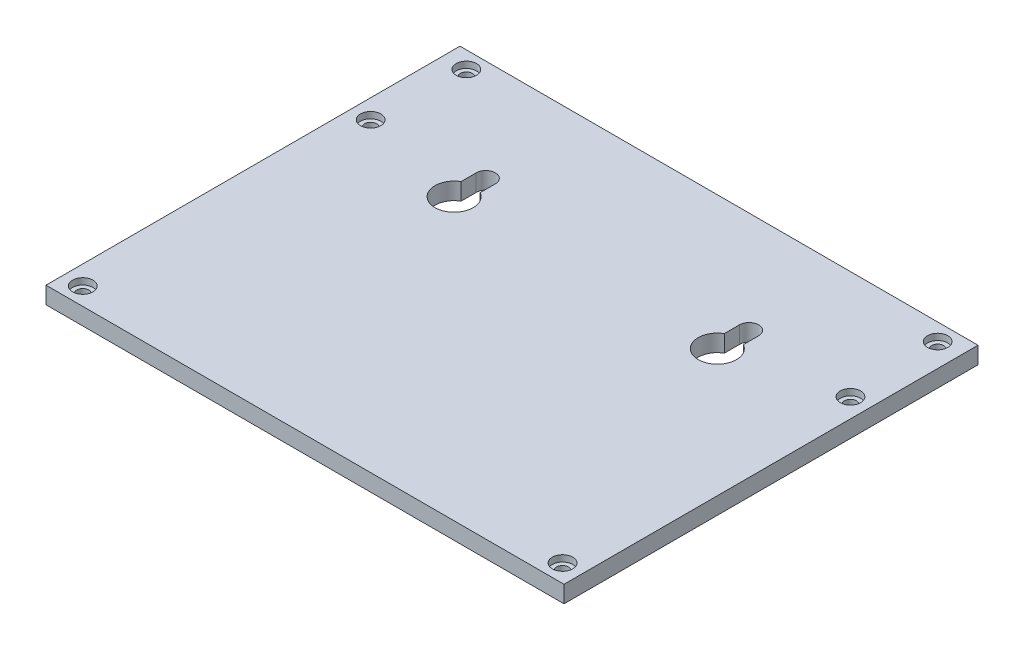
ISO-10303-21;
HEADER;
FILE_DESCRIPTION(('STEP AP214'),'2;1');
FILE_NAME('part.step','',(''),(''),'','','');
FILE_SCHEMA(('AUTOMOTIVE_DESIGN { 1 0 10303 214 1 1 1 1 }'));
ENDSEC;
DATA;
#1=APPLICATION_CONTEXT('core data for automotive mechanical design processes');
#2=APPLICATION_PROTOCOL_DEFINITION('international standard','automotive_design',2000,#1);
#3=PRODUCT_CONTEXT('',#1,'mechanical');
#4=PRODUCT('Part','Part','',(#3));
#5=PRODUCT_RELATED_PRODUCT_CATEGORY('part','',(#4));
#6=PRODUCT_DEFINITION_FORMATION('','',#4);
#7=PRODUCT_DEFINITION_CONTEXT('part definition',#1,'design');
#8=PRODUCT_DEFINITION('design','',#6,#7);
#9=PRODUCT_DEFINITION_SHAPE('','',#8);
#10=(LENGTH_UNIT() NAMED_UNIT(*) SI_UNIT(.MILLI.,.METRE.));
#11=(NAMED_UNIT(*) PLANE_ANGLE_UNIT() SI_UNIT($,.RADIAN.));
#12=(NAMED_UNIT(*) SI_UNIT($,.STERADIAN.) SOLID_ANGLE_UNIT());
#13=UNCERTAINTY_MEASURE_WITH_UNIT(LENGTH_MEASURE(1.E-05),#10,'distance_accuracy_value','');
#14=(GEOMETRIC_REPRESENTATION_CONTEXT(3) GLOBAL_UNCERTAINTY_ASSIGNED_CONTEXT((#13)) GLOBAL_UNIT_ASSIGNED_CONTEXT((#10,
#11,#12)) REPRESENTATION_CONTEXT('',''));
#15=CARTESIAN_POINT('',(0.,0.,0.));
#16=DIRECTION('',(0.,0.,1.));
#17=DIRECTION('',(1.,0.,0.));
#18=AXIS2_PLACEMENT_3D('',#15,#16,#17);
#19=CARTESIAN_POINT('',(-86.90625,0.,53.261875));
#20=DIRECTION('',(0.,1.,0.));
#21=DIRECTION('',(0.,0.,1.));
#22=AXIS2_PLACEMENT_3D('',#19,#20,#21);
#23=CYLINDRICAL_SURFACE('',#22,1.4);
#24=CARTESIAN_POINT('',(-86.90625,0.,53.261875));
#25=DIRECTION('',(0.,1.,0.));
#26=DIRECTION('',(0.,0.,1.));
#27=AXIS2_PLACEMENT_3D('',#24,#25,#26);
#28=CIRCLE('',#27,1.4);
#29=CARTESIAN_POINT('',(-86.90625,0.,54.661875));
#30=VERTEX_POINT('',#29);
#31=EDGE_CURVE('E245',#30,#30,#28,.T.);
#32=ORIENTED_EDGE('',*,*,#31,.F.);
#33=EDGE_LOOP('',(#32));
#34=FACE_BOUND('',#33,.T.);
#35=CARTESIAN_POINT('',(-86.90625,2.5,53.261875));
#36=DIRECTION('',(0.,1.,0.));
#37=DIRECTION('',(0.,0.,1.));
#38=AXIS2_PLACEMENT_3D('',#35,#36,#37);
#39=CIRCLE('',#38,1.4);
#40=CARTESIAN_POINT('',(-86.90625,2.5,54.661875));
#41=VERTEX_POINT('',#40);
#42=EDGE_CURVE('E39',#41,#41,#39,.F.);
#43=ORIENTED_EDGE('',*,*,#42,.F.);
#44=EDGE_LOOP('',(#43));
#45=FACE_BOUND('',#44,.T.);
#46=ADVANCED_FACE('F35',(#34,#45),#23,.F.);
#47=CARTESIAN_POINT('',(25.09375,0.,-36.078125));
#48=DIRECTION('',(0.,1.,0.));
#49=DIRECTION('',(0.,0.,1.));
#50=AXIS2_PLACEMENT_3D('',#47,#48,#49);
#51=CYLINDRICAL_SURFACE('',#50,1.4);
#52=CARTESIAN_POINT('',(25.09375,0.,-36.078125));
#53=DIRECTION('',(0.,1.,0.));
#54=DIRECTION('',(0.,0.,1.));
#55=AXIS2_PLACEMENT_3D('',#52,#53,#54);
#56=CIRCLE('',#55,1.4);
#57=CARTESIAN_POINT('',(25.09375,0.,-34.678125));
#58=VERTEX_POINT('',#57);
#59=EDGE_CURVE('E232',#58,#58,#56,.T.);
#60=ORIENTED_EDGE('',*,*,#59,.F.);
#61=EDGE_LOOP('',(#60));
#62=FACE_BOUND('',#61,.T.);
#63=CARTESIAN_POINT('',(25.09375,2.5,-36.078125));
#64=DIRECTION('',(0.,1.,0.));
#65=DIRECTION('',(0.,0.,1.));
#66=AXIS2_PLACEMENT_3D('',#63,#64,#65);
#67=CIRCLE('',#66,1.4);
#68=CARTESIAN_POINT('',(25.09375,2.5,-34.678125));
#69=VERTEX_POINT('',#68);
#70=EDGE_CURVE('E286',#69,#69,#67,.F.);
#71=ORIENTED_EDGE('',*,*,#70,.F.);
#72=EDGE_LOOP('',(#71));
#73=FACE_BOUND('',#72,.T.);
#74=ADVANCED_FACE('F296',(#62,#73),#51,.F.);
#75=CARTESIAN_POINT('',(-86.90625,0.,-14.538125));
#76=DIRECTION('',(0.,1.,0.));
#77=DIRECTION('',(0.,0.,1.));
#78=AXIS2_PLACEMENT_3D('',#75,#76,#77);
#79=CYLINDRICAL_SURFACE('',#78,1.4);
#80=CARTESIAN_POINT('',(-86.90625,0.,-14.538125));
#81=DIRECTION('',(0.,1.,0.));
#82=DIRECTION('',(0.,0.,1.));
#83=AXIS2_PLACEMENT_3D('',#80,#81,#82);
#84=CIRCLE('',#83,1.4);
#85=CARTESIAN_POINT('',(-86.90625,0.,-13.138125));
#86=VERTEX_POINT('',#85);
#87=EDGE_CURVE('E242',#86,#86,#84,.T.);
#88=ORIENTED_EDGE('',*,*,#87,.F.);
#89=EDGE_LOOP('',(#88));
#90=FACE_BOUND('',#89,.T.);
#91=CARTESIAN_POINT('',(-86.90625,2.5,-14.538125));
#92=DIRECTION('',(0.,1.,0.));
#93=DIRECTION('',(0.,0.,1.));
#94=AXIS2_PLACEMENT_3D('',#91,#92,#93);
#95=CIRCLE('',#94,1.4);
#96=CARTESIAN_POINT('',(-86.90625,2.5,-13.138125));
#97=VERTEX_POINT('',#96);
#98=EDGE_CURVE('E284',#97,#97,#95,.F.);
#99=ORIENTED_EDGE('',*,*,#98,.F.);
#100=EDGE_LOOP('',(#99));
#101=FACE_BOUND('',#100,.T.);
#102=ADVANCED_FACE('F302',(#90,#101),#79,.F.);
#103=CARTESIAN_POINT('',(26.09375,0.,-14.538125));
#104=DIRECTION('',(0.,1.,0.));
#105=DIRECTION('',(0.,0.,1.));
#106=AXIS2_PLACEMENT_3D('',#103,#104,#105);
#107=CYLINDRICAL_SURFACE('',#106,1.4);
#108=CARTESIAN_POINT('',(26.09375,0.,-14.538125));
#109=DIRECTION('',(0.,1.,0.));
#110=DIRECTION('',(0.,0.,1.));
#111=AXIS2_PLACEMENT_3D('',#108,#109,#110);
#112=CIRCLE('',#111,1.4);
#113=CARTESIAN_POINT('',(26.09375,0.,-13.138125));
#114=VERTEX_POINT('',#113);
#115=EDGE_CURVE('E239',#114,#114,#112,.T.);
#116=ORIENTED_EDGE('',*,*,#115,.F.);
#117=EDGE_LOOP('',(#116));
#118=FACE_BOUND('',#117,.T.);
#119=CARTESIAN_POINT('',(26.09375,2.5,-14.538125));
#120=DIRECTION('',(0.,1.,0.));
#121=DIRECTION('',(0.,0.,1.));
#122=AXIS2_PLACEMENT_3D('',#119,#120,#121);
#123=CIRCLE('',#122,1.4);
#124=CARTESIAN_POINT('',(26.09375,2.5,-13.138125));
#125=VERTEX_POINT('',#124);
#126=EDGE_CURVE('E281',#125,#125,#123,.F.);
#127=ORIENTED_EDGE('',*,*,#126,.F.);
#128=EDGE_LOOP('',(#127));
#129=FACE_BOUND('',#128,.T.);
#130=ADVANCED_FACE('F308',(#118,#129),#107,.F.);
#131=CARTESIAN_POINT('',(26.09375,0.,53.261875));
#132=DIRECTION('',(0.,1.,0.));
#133=DIRECTION('',(0.,0.,1.));
#134=AXIS2_PLACEMENT_3D('',#131,#132,#133);
#135=CYLINDRICAL_SURFACE('',#134,1.4);
#136=CARTESIAN_POINT('',(26.09375,0.,53.261875));
#137=DIRECTION('',(0.,1.,0.));
#138=DIRECTION('',(0.,0.,1.));
#139=AXIS2_PLACEMENT_3D('',#136,#137,#138);
#140=CIRCLE('',#139,1.4);
#141=CARTESIAN_POINT('',(26.09375,0.,54.661875));
#142=VERTEX_POINT('',#141);
#143=EDGE_CURVE('E236',#142,#142,#140,.T.);
#144=ORIENTED_EDGE('',*,*,#143,.F.);
#145=EDGE_LOOP('',(#144));
#146=FACE_BOUND('',#145,.T.);
#147=CARTESIAN_POINT('',(26.09375,2.5,53.261875));
#148=DIRECTION('',(0.,1.,0.));
#149=DIRECTION('',(0.,0.,1.));
#150=AXIS2_PLACEMENT_3D('',#147,#148,#149);
#151=CIRCLE('',#150,1.4);
#152=CARTESIAN_POINT('',(26.09375,2.5,54.661875));
#153=VERTEX_POINT('',#152);
#154=EDGE_CURVE('E278',#153,#153,#151,.F.);
#155=ORIENTED_EDGE('',*,*,#154,.F.);
#156=EDGE_LOOP('',(#155));
#157=FACE_BOUND('',#156,.T.);
#158=ADVANCED_FACE('F347',(#146,#157),#135,.F.);
#159=CARTESIAN_POINT('',(-85.90625,0.,-36.078125));
#160=DIRECTION('',(0.,1.,0.));
#161=DIRECTION('',(0.,0.,1.));
#162=AXIS2_PLACEMENT_3D('',#159,#160,#161);
#163=CYLINDRICAL_SURFACE('',#162,1.4);
#164=CARTESIAN_POINT('',(-85.90625,0.,-36.078125));
#165=DIRECTION('',(0.,1.,0.));
#166=DIRECTION('',(0.,0.,1.));
#167=AXIS2_PLACEMENT_3D('',#164,#165,#166);
#168=CIRCLE('',#167,1.4);
#169=CARTESIAN_POINT('',(-85.90625,0.,-34.678125));
#170=VERTEX_POINT('',#169);
#171=EDGE_CURVE('E235',#170,#170,#168,.T.);
#172=ORIENTED_EDGE('',*,*,#171,.F.);
#173=EDGE_LOOP('',(#172));
#174=FACE_BOUND('',#173,.T.);
#175=CARTESIAN_POINT('',(-85.90625,2.5,-36.078125));
#176=DIRECTION('',(0.,1.,0.));
#177=DIRECTION('',(0.,0.,1.));
#178=AXIS2_PLACEMENT_3D('',#175,#176,#177);
#179=CIRCLE('',#178,1.4);
#180=CARTESIAN_POINT('',(-85.90625,2.5,-34.678125));
#181=VERTEX_POINT('',#180);
#182=EDGE_CURVE('E229',#181,#181,#179,.F.);
#183=ORIENTED_EDGE('',*,*,#182,.F.);
#184=EDGE_LOOP('',(#183));
#185=FACE_BOUND('',#184,.T.);
#186=ADVANCED_FACE('F330',(#174,#185),#163,.F.);
#187=CARTESIAN_POINT('',(-91.40625,4.,-40.078125));
#188=DIRECTION('',(1.,0.,0.));
#189=DIRECTION('',(0.,0.,-1.));
#190=AXIS2_PLACEMENT_3D('',#187,#188,#189);
#191=PLANE('',#190);
#192=DIRECTION('',(0.,0.,1.));
#193=VECTOR('',#192,1.);
#194=CARTESIAN_POINT('',(-91.40625,0.,-40.078125));
#195=LINE('',#194,#193);
#196=CARTESIAN_POINT('',(-91.40625,0.,-40.078125));
#197=VERTEX_POINT('',#196);
#198=CARTESIAN_POINT('',(-91.40625,0.,57.421875));
#199=VERTEX_POINT('',#198);
#200=EDGE_CURVE('E250',#197,#199,#195,.T.);
#201=ORIENTED_EDGE('',*,*,#200,.T.);
#202=DIRECTION('',(0.,-1.,0.));
#203=VECTOR('',#202,1.);
#204=CARTESIAN_POINT('',(-91.40625,4.,57.421875));
#205=LINE('',#204,#203);
#206=CARTESIAN_POINT('',(-91.40625,4.,57.421875));
#207=VERTEX_POINT('',#206);
#208=EDGE_CURVE('E11',#207,#199,#205,.T.);
#209=ORIENTED_EDGE('',*,*,#208,.F.);
#210=DIRECTION('',(0.,0.,1.));
#211=VECTOR('',#210,1.);
#212=CARTESIAN_POINT('',(-91.40625,4.,-40.078125));
#213=LINE('',#212,#211);
#214=CARTESIAN_POINT('',(-91.40625,4.,-40.078125));
#215=VERTEX_POINT('',#214);
#216=EDGE_CURVE('E251',#215,#207,#213,.T.);
#217=ORIENTED_EDGE('',*,*,#216,.F.);
#218=DIRECTION('',(0.,-1.,0.));
#219=VECTOR('',#218,1.);
#220=CARTESIAN_POINT('',(-91.40625,4.,-40.078125));
#221=LINE('',#220,#219);
#222=EDGE_CURVE('E261',#215,#197,#221,.T.);
#223=ORIENTED_EDGE('',*,*,#222,.T.);
#224=EDGE_LOOP('',(#201,#209,#217,#223));
#225=FACE_BOUND('',#224,.T.);
#226=ADVANCED_FACE('F37',(#225),#191,.F.);
#227=CARTESIAN_POINT('',(-91.40625,4.,57.421875));
#228=DIRECTION('',(0.,0.,-1.));
#229=DIRECTION('',(-1.,0.,0.));
#230=AXIS2_PLACEMENT_3D('',#227,#228,#229);
#231=PLANE('',#230);
#232=DIRECTION('',(1.,0.,0.));
#233=VECTOR('',#232,1.);
#234=CARTESIAN_POINT('',(-91.40625,0.,57.421875));
#235=LINE('',#234,#233);
#236=CARTESIAN_POINT('',(30.59375,0.,57.421875));
#237=VERTEX_POINT('',#236);
#238=EDGE_CURVE('E264',#199,#237,#235,.T.);
#239=ORIENTED_EDGE('',*,*,#238,.T.);
#240=DIRECTION('',(0.,-1.,0.));
#241=VECTOR('',#240,1.);
#242=CARTESIAN_POINT('',(30.59375,4.,57.421875));
#243=LINE('',#242,#241);
#244=CARTESIAN_POINT('',(30.59375,4.,57.421875));
#245=VERTEX_POINT('',#244);
#246=EDGE_CURVE('E44',#245,#237,#243,.T.);
#247=ORIENTED_EDGE('',*,*,#246,.F.);
#248=DIRECTION('',(1.,0.,0.));
#249=VECTOR('',#248,1.);
#250=CARTESIAN_POINT('',(-91.40625,4.,57.421875));
#251=LINE('',#250,#249);
#252=EDGE_CURVE('E254',#207,#245,#251,.T.);
#253=ORIENTED_EDGE('',*,*,#252,.F.);
#254=ORIENTED_EDGE('',*,*,#208,.T.);
#255=EDGE_LOOP('',(#239,#247,#253,#254));
#256=FACE_BOUND('',#255,.T.);
#257=ADVANCED_FACE('F323',(#256),#231,.F.);
#258=CARTESIAN_POINT('',(30.59375,4.,-40.078125));
#259=DIRECTION('',(-1.,0.,0.));
#260=DIRECTION('',(0.,0.,1.));
#261=AXIS2_PLACEMENT_3D('',#258,#259,#260);
#262=PLANE('',#261);
#263=DIRECTION('',(0.,0.,-1.));
#264=VECTOR('',#263,1.);
#265=CARTESIAN_POINT('',(30.59375,0.,-40.078125));
#266=LINE('',#265,#264);
#267=CARTESIAN_POINT('',(30.59375,0.,-40.078125));
#268=VERTEX_POINT('',#267);
#269=EDGE_CURVE('E266',#237,#268,#266,.T.);
#270=ORIENTED_EDGE('',*,*,#269,.T.);
#271=DIRECTION('',(0.,-1.,0.));
#272=VECTOR('',#271,1.);
#273=CARTESIAN_POINT('',(30.59375,4.,-40.078125));
#274=LINE('',#273,#272);
#275=CARTESIAN_POINT('',(30.59375,4.,-40.078125));
#276=VERTEX_POINT('',#275);
#277=EDGE_CURVE('E271',#276,#268,#274,.T.);
#278=ORIENTED_EDGE('',*,*,#277,.F.);
#279=DIRECTION('',(0.,0.,-1.));
#280=VECTOR('',#279,1.);
#281=CARTESIAN_POINT('',(30.59375,4.,-40.078125));
#282=LINE('',#281,#280);
#283=EDGE_CURVE('E257',#245,#276,#282,.T.);
#284=ORIENTED_EDGE('',*,*,#283,.F.);
#285=ORIENTED_EDGE('',*,*,#246,.T.);
#286=EDGE_LOOP('',(#270,#278,#284,#285));
#287=FACE_BOUND('',#286,.T.);
#288=ADVANCED_FACE('F320',(#287),#262,.F.);
#289=CARTESIAN_POINT('',(-91.40625,4.,-40.078125));
#290=DIRECTION('',(0.,0.,1.));
#291=DIRECTION('',(1.,0.,0.));
#292=AXIS2_PLACEMENT_3D('',#289,#290,#291);
#293=PLANE('',#292);
#294=DIRECTION('',(-1.,0.,0.));
#295=VECTOR('',#294,1.);
#296=CARTESIAN_POINT('',(-91.40625,0.,-40.078125));
#297=LINE('',#296,#295);
#298=EDGE_CURVE('E255',#268,#197,#297,.T.);
#299=ORIENTED_EDGE('',*,*,#298,.T.);
#300=ORIENTED_EDGE('',*,*,#222,.F.);
#301=DIRECTION('',(-1.,0.,0.));
#302=VECTOR('',#301,1.);
#303=CARTESIAN_POINT('',(-91.40625,4.,-40.078125));
#304=LINE('',#303,#302);
#305=EDGE_CURVE('E259',#276,#215,#304,.T.);
#306=ORIENTED_EDGE('',*,*,#305,.F.);
#307=ORIENTED_EDGE('',*,*,#277,.T.);
#308=EDGE_LOOP('',(#299,#300,#306,#307));
#309=FACE_BOUND('',#308,.T.);
#310=ADVANCED_FACE('F313',(#309),#293,.F.);
#311=CARTESIAN_POINT('',(0.,4.,0.));
#312=DIRECTION('',(0.,1.,0.));
#313=DIRECTION('',(0.,0.,1.));
#314=AXIS2_PLACEMENT_3D('',#311,#312,#313);
#315=PLANE('',#314);
#316=CARTESIAN_POINT('',(-61.40625,4.,-16.1573157606777));
#317=DIRECTION('',(0.,1.,0.));
#318=DIRECTION('',(0.,0.,-1.));
#319=AXIS2_PLACEMENT_3D('',#316,#317,#318);
#320=CIRCLE('',#319,2.25);
#321=CARTESIAN_POINT('',(-59.15625,4.,-16.1573157606777));
#322=VERTEX_POINT('',#321);
#323=CARTESIAN_POINT('',(-63.65625,4.,-16.1573157606777));
#324=VERTEX_POINT('',#323);
#325=EDGE_CURVE('E52',#322,#324,#320,.T.);
#326=ORIENTED_EDGE('',*,*,#325,.F.);
#327=DIRECTION('',(0.,0.,-1.));
#328=VECTOR('',#327,1.);
#329=CARTESIAN_POINT('',(-59.15625,4.,-16.1573157606777));
#330=LINE('',#329,#328);
#331=CARTESIAN_POINT('',(-59.15625,4.,-12.5862873828199));
#332=VERTEX_POINT('',#331);
#333=EDGE_CURVE('E147',#332,#322,#330,.T.);
#334=ORIENTED_EDGE('',*,*,#333,.F.);
#335=CARTESIAN_POINT('',(-61.40625,4.,-8.68956692335936));
#336=DIRECTION('',(0.,1.,0.));
#337=DIRECTION('',(0.,0.,-1.));
#338=AXIS2_PLACEMENT_3D('',#335,#336,#337);
#339=CIRCLE('',#338,4.49965891364867);
#340=CARTESIAN_POINT('',(-63.65625,4.,-12.5862873828198));
#341=VERTEX_POINT('',#340);
#342=EDGE_CURVE('E150',#341,#332,#339,.T.);
#343=ORIENTED_EDGE('',*,*,#342,.F.);
#344=DIRECTION('',(0.,0.,1.));
#345=VECTOR('',#344,1.);
#346=CARTESIAN_POINT('',(-63.65625,4.,-16.1573157606777));
#347=LINE('',#346,#345);
#348=EDGE_CURVE('E156',#324,#341,#347,.T.);
#349=ORIENTED_EDGE('',*,*,#348,.F.);
#350=EDGE_LOOP('',(#326,#334,#343,#349));
#351=FACE_BOUND('',#350,.T.);
#352=CARTESIAN_POINT('',(0.593749999999969,4.,-16.1573157606777));
#353=DIRECTION('',(0.,1.,0.));
#354=DIRECTION('',(0.,0.,-1.));
#355=AXIS2_PLACEMENT_3D('',#352,#353,#354);
#356=CIRCLE('',#355,2.25);
#357=CARTESIAN_POINT('',(2.84374999999996,4.,-16.1573157606777));
#358=VERTEX_POINT('',#357);
#359=CARTESIAN_POINT('',(-1.65625000000003,4.,-16.1573157606777));
#360=VERTEX_POINT('',#359);
#361=EDGE_CURVE('E60',#358,#360,#356,.T.);
#362=ORIENTED_EDGE('',*,*,#361,.F.);
#363=DIRECTION('',(0.,0.,-1.));
#364=VECTOR('',#363,1.);
#365=CARTESIAN_POINT('',(2.84374999999996,4.,-16.1573157606777));
#366=LINE('',#365,#364);
#367=CARTESIAN_POINT('',(2.84374999999997,4.,-12.5862873828199));
#368=VERTEX_POINT('',#367);
#369=EDGE_CURVE('E171',#368,#358,#366,.T.);
#370=ORIENTED_EDGE('',*,*,#369,.F.);
#371=CARTESIAN_POINT('',(0.593749999999976,4.,-8.68956692335936));
#372=DIRECTION('',(0.,1.,0.));
#373=DIRECTION('',(0.,0.,-1.));
#374=AXIS2_PLACEMENT_3D('',#371,#372,#373);
#375=CIRCLE('',#374,4.49965891364867);
#376=CARTESIAN_POINT('',(-1.65625000000003,4.,-12.5862873828198));
#377=VERTEX_POINT('',#376);
#378=EDGE_CURVE('E185',#377,#368,#375,.T.);
#379=ORIENTED_EDGE('',*,*,#378,.F.);
#380=DIRECTION('',(0.,0.,1.));
#381=VECTOR('',#380,1.);
#382=CARTESIAN_POINT('',(-1.65625000000003,4.,-16.1573157606777));
#383=LINE('',#382,#381);
#384=EDGE_CURVE('E182',#360,#377,#383,.T.);
#385=ORIENTED_EDGE('',*,*,#384,.F.);
#386=EDGE_LOOP('',(#362,#370,#379,#385));
#387=FACE_BOUND('',#386,.T.);
#388=CARTESIAN_POINT('',(-86.90625,4.,53.261875));
#389=DIRECTION('',(0.,1.,0.));
#390=DIRECTION('',(0.,0.,1.));
#391=AXIS2_PLACEMENT_3D('',#388,#389,#390);
#392=CIRCLE('',#391,2.4);
#393=CARTESIAN_POINT('',(-86.90625,4.,55.661875));
#394=VERTEX_POINT('',#393);
#395=EDGE_CURVE('E206',#394,#394,#392,.T.);
#396=ORIENTED_EDGE('',*,*,#395,.F.);
#397=EDGE_LOOP('',(#396));
#398=FACE_BOUND('',#397,.T.);
#399=CARTESIAN_POINT('',(26.09375,4.,53.261875));
#400=DIRECTION('',(0.,1.,0.));
#401=DIRECTION('',(0.,0.,1.));
#402=AXIS2_PLACEMENT_3D('',#399,#400,#401);
#403=CIRCLE('',#402,2.4);
#404=CARTESIAN_POINT('',(26.09375,4.,55.661875));
#405=VERTEX_POINT('',#404);
#406=EDGE_CURVE('E212',#405,#405,#403,.T.);
#407=ORIENTED_EDGE('',*,*,#406,.F.);
#408=EDGE_LOOP('',(#407));
#409=FACE_BOUND('',#408,.T.);
#410=CARTESIAN_POINT('',(26.09375,4.,-14.538125));
#411=DIRECTION('',(0.,1.,0.));
#412=DIRECTION('',(0.,0.,1.));
#413=AXIS2_PLACEMENT_3D('',#410,#411,#412);
#414=CIRCLE('',#413,2.4);
#415=CARTESIAN_POINT('',(26.09375,4.,-12.138125));
#416=VERTEX_POINT('',#415);
#417=EDGE_CURVE('E218',#416,#416,#414,.T.);
#418=ORIENTED_EDGE('',*,*,#417,.F.);
#419=EDGE_LOOP('',(#418));
#420=FACE_BOUND('',#419,.T.);
#421=CARTESIAN_POINT('',(-85.90625,4.,-36.078125));
#422=DIRECTION('',(0.,1.,0.));
#423=DIRECTION('',(0.,0.,1.));
#424=AXIS2_PLACEMENT_3D('',#421,#422,#423);
#425=CIRCLE('',#424,2.4);
#426=CARTESIAN_POINT('',(-85.90625,4.,-33.678125));
#427=VERTEX_POINT('',#426);
#428=EDGE_CURVE('E199',#427,#427,#425,.T.);
#429=ORIENTED_EDGE('',*,*,#428,.F.);
#430=EDGE_LOOP('',(#429));
#431=FACE_BOUND('',#430,.T.);
#432=CARTESIAN_POINT('',(25.09375,4.,-36.078125));
#433=DIRECTION('',(0.,1.,0.));
#434=DIRECTION('',(0.,0.,1.));
#435=AXIS2_PLACEMENT_3D('',#432,#433,#434);
#436=CIRCLE('',#435,2.4);
#437=CARTESIAN_POINT('',(25.09375,4.,-33.678125));
#438=VERTEX_POINT('',#437);
#439=EDGE_CURVE('E163',#438,#438,#436,.T.);
#440=ORIENTED_EDGE('',*,*,#439,.F.);
#441=EDGE_LOOP('',(#440));
#442=FACE_BOUND('',#441,.T.);
#443=CARTESIAN_POINT('',(-86.90625,4.,-14.538125));
#444=DIRECTION('',(0.,1.,0.));
#445=DIRECTION('',(0.,0.,1.));
#446=AXIS2_PLACEMENT_3D('',#443,#444,#445);
#447=CIRCLE('',#446,2.4);
#448=CARTESIAN_POINT('',(-86.90625,4.,-12.138125));
#449=VERTEX_POINT('',#448);
#450=EDGE_CURVE('E205',#449,#449,#447,.T.);
#451=ORIENTED_EDGE('',*,*,#450,.F.);
#452=EDGE_LOOP('',(#451));
#453=FACE_BOUND('',#452,.T.);
#454=ORIENTED_EDGE('',*,*,#216,.T.);
#455=ORIENTED_EDGE('',*,*,#252,.T.);
#456=ORIENTED_EDGE('',*,*,#283,.T.);
#457=ORIENTED_EDGE('',*,*,#305,.T.);
#458=EDGE_LOOP('',(#454,#455,#456,#457));
#459=FACE_BOUND('',#458,.T.);
#460=ADVANCED_FACE('F310',(#351,#387,#398,#409,#420,#431,#442,#453,#459),#315,.T.);
#461=CARTESIAN_POINT('',(0.,0.,0.));
#462=DIRECTION('',(0.,1.,0.));
#463=DIRECTION('',(0.,0.,1.));
#464=AXIS2_PLACEMENT_3D('',#461,#462,#463);
#465=PLANE('',#464);
#466=DIRECTION('',(0.,0.,-1.));
#467=VECTOR('',#466,1.);
#468=CARTESIAN_POINT('',(-59.15625,0.,-16.1573157606777));
#469=LINE('',#468,#467);
#470=CARTESIAN_POINT('',(-59.15625,0.,-12.5862873828199));
#471=VERTEX_POINT('',#470);
#472=CARTESIAN_POINT('',(-59.15625,0.,-16.1573157606777));
#473=VERTEX_POINT('',#472);
#474=EDGE_CURVE('E134',#471,#473,#469,.T.);
#475=ORIENTED_EDGE('',*,*,#474,.T.);
#476=CARTESIAN_POINT('',(-61.40625,0.,-16.1573157606777));
#477=DIRECTION('',(0.,1.,0.));
#478=DIRECTION('',(0.,0.,-1.));
#479=AXIS2_PLACEMENT_3D('',#476,#477,#478);
#480=CIRCLE('',#479,2.25);
#481=CARTESIAN_POINT('',(-63.65625,0.,-16.1573157606777));
#482=VERTEX_POINT('',#481);
#483=EDGE_CURVE('E128',#473,#482,#480,.T.);
#484=ORIENTED_EDGE('',*,*,#483,.T.);
#485=DIRECTION('',(0.,0.,1.));
#486=VECTOR('',#485,1.);
#487=CARTESIAN_POINT('',(-63.65625,0.,-16.1573157606777));
#488=LINE('',#487,#486);
#489=CARTESIAN_POINT('',(-63.65625,0.,-12.5862873828198));
#490=VERTEX_POINT('',#489);
#491=EDGE_CURVE('E138',#482,#490,#488,.T.);
#492=ORIENTED_EDGE('',*,*,#491,.T.);
#493=CARTESIAN_POINT('',(-61.40625,0.,-8.68956692335936));
#494=DIRECTION('',(0.,1.,0.));
#495=DIRECTION('',(0.,0.,-1.));
#496=AXIS2_PLACEMENT_3D('',#493,#494,#495);
#497=CIRCLE('',#496,4.49965891364867);
#498=EDGE_CURVE('E142',#490,#471,#497,.T.);
#499=ORIENTED_EDGE('',*,*,#498,.T.);
#500=EDGE_LOOP('',(#475,#484,#492,#499));
#501=FACE_BOUND('',#500,.T.);
#502=DIRECTION('',(0.,0.,-1.));
#503=VECTOR('',#502,1.);
#504=CARTESIAN_POINT('',(2.84374999999996,0.,-16.1573157606777));
#505=LINE('',#504,#503);
#506=CARTESIAN_POINT('',(2.84374999999997,0.,-12.5862873828199));
#507=VERTEX_POINT('',#506);
#508=CARTESIAN_POINT('',(2.84374999999996,0.,-16.1573157606777));
#509=VERTEX_POINT('',#508);
#510=EDGE_CURVE('E177',#507,#509,#505,.T.);
#511=ORIENTED_EDGE('',*,*,#510,.T.);
#512=CARTESIAN_POINT('',(0.593749999999969,0.,-16.1573157606777));
#513=DIRECTION('',(0.,1.,0.));
#514=DIRECTION('',(0.,0.,-1.));
#515=AXIS2_PLACEMENT_3D('',#512,#513,#514);
#516=CIRCLE('',#515,2.25);
#517=CARTESIAN_POINT('',(-1.65625000000003,0.,-16.1573157606777));
#518=VERTEX_POINT('',#517);
#519=EDGE_CURVE('E167',#509,#518,#516,.T.);
#520=ORIENTED_EDGE('',*,*,#519,.T.);
#521=DIRECTION('',(0.,0.,1.));
#522=VECTOR('',#521,1.);
#523=CARTESIAN_POINT('',(-1.65625000000003,0.,-16.1573157606777));
#524=LINE('',#523,#522);
#525=CARTESIAN_POINT('',(-1.65625000000003,0.,-12.5862873828198));
#526=VERTEX_POINT('',#525);
#527=EDGE_CURVE('E170',#518,#526,#524,.T.);
#528=ORIENTED_EDGE('',*,*,#527,.T.);
#529=CARTESIAN_POINT('',(0.593749999999976,0.,-8.68956692335936));
#530=DIRECTION('',(0.,1.,0.));
#531=DIRECTION('',(0.,0.,-1.));
#532=AXIS2_PLACEMENT_3D('',#529,#530,#531);
#533=CIRCLE('',#532,4.49965891364867);
#534=EDGE_CURVE('E174',#526,#507,#533,.T.);
#535=ORIENTED_EDGE('',*,*,#534,.T.);
#536=EDGE_LOOP('',(#511,#520,#528,#535));
#537=FACE_BOUND('',#536,.T.);
#538=ORIENTED_EDGE('',*,*,#171,.T.);
#539=EDGE_LOOP('',(#538));
#540=FACE_BOUND('',#539,.T.);
#541=ORIENTED_EDGE('',*,*,#143,.T.);
#542=EDGE_LOOP('',(#541));
#543=FACE_BOUND('',#542,.T.);
#544=ORIENTED_EDGE('',*,*,#115,.T.);
#545=EDGE_LOOP('',(#544));
#546=FACE_BOUND('',#545,.T.);
#547=ORIENTED_EDGE('',*,*,#87,.T.);
#548=EDGE_LOOP('',(#547));
#549=FACE_BOUND('',#548,.T.);
#550=ORIENTED_EDGE('',*,*,#59,.T.);
#551=EDGE_LOOP('',(#550));
#552=FACE_BOUND('',#551,.T.);
#553=ORIENTED_EDGE('',*,*,#31,.T.);
#554=EDGE_LOOP('',(#553));
#555=FACE_BOUND('',#554,.T.);
#556=ORIENTED_EDGE('',*,*,#200,.F.);
#557=ORIENTED_EDGE('',*,*,#298,.F.);
#558=ORIENTED_EDGE('',*,*,#269,.F.);
#559=ORIENTED_EDGE('',*,*,#238,.F.);
#560=EDGE_LOOP('',(#556,#557,#558,#559));
#561=FACE_BOUND('',#560,.T.);
#562=ADVANCED_FACE('F144',(#501,#537,#540,#543,#546,#549,#552,#555,#561),#465,.F.);
#563=CARTESIAN_POINT('',(-85.90625,2.5,-36.078125));
#564=DIRECTION('',(0.,1.,0.));
#565=DIRECTION('',(0.,0.,1.));
#566=AXIS2_PLACEMENT_3D('',#563,#564,#565);
#567=PLANE('',#566);
#568=CARTESIAN_POINT('',(-85.90625,2.5,-36.078125));
#569=DIRECTION('',(0.,1.,0.));
#570=DIRECTION('',(0.,0.,1.));
#571=AXIS2_PLACEMENT_3D('',#568,#569,#570);
#572=CIRCLE('',#571,2.4);
#573=CARTESIAN_POINT('',(-85.90625,2.5,-33.678125));
#574=VERTEX_POINT('',#573);
#575=EDGE_CURVE('E221',#574,#574,#572,.T.);
#576=ORIENTED_EDGE('',*,*,#575,.T.);
#577=EDGE_LOOP('',(#576));
#578=FACE_BOUND('',#577,.T.);
#579=ORIENTED_EDGE('',*,*,#182,.T.);
#580=EDGE_LOOP('',(#579));
#581=FACE_BOUND('',#580,.T.);
#582=ADVANCED_FACE('F317',(#578,#581),#567,.T.);
#583=CARTESIAN_POINT('',(-85.90625,2.5,-36.078125));
#584=DIRECTION('',(0.,1.,0.));
#585=DIRECTION('',(0.,0.,1.));
#586=AXIS2_PLACEMENT_3D('',#583,#584,#585);
#587=CYLINDRICAL_SURFACE('',#586,2.4);
#588=ORIENTED_EDGE('',*,*,#575,.F.);
#589=EDGE_LOOP('',(#588));
#590=FACE_BOUND('',#589,.T.);
#591=ORIENTED_EDGE('',*,*,#428,.T.);
#592=EDGE_LOOP('',(#591));
#593=FACE_BOUND('',#592,.T.);
#594=ADVANCED_FACE('F384',(#590,#593),#587,.F.);
#595=CARTESIAN_POINT('',(26.09375,2.5,53.261875));
#596=DIRECTION('',(0.,1.,0.));
#597=DIRECTION('',(0.,0.,1.));
#598=AXIS2_PLACEMENT_3D('',#595,#596,#597);
#599=PLANE('',#598);
#600=CARTESIAN_POINT('',(26.09375,2.5,53.261875));
#601=DIRECTION('',(0.,1.,0.));
#602=DIRECTION('',(0.,0.,1.));
#603=AXIS2_PLACEMENT_3D('',#600,#601,#602);
#604=CIRCLE('',#603,2.4);
#605=CARTESIAN_POINT('',(26.09375,2.5,55.661875));
#606=VERTEX_POINT('',#605);
#607=EDGE_CURVE('E209',#606,#606,#604,.T.);
#608=ORIENTED_EDGE('',*,*,#607,.T.);
#609=EDGE_LOOP('',(#608));
#610=FACE_BOUND('',#609,.T.);
#611=ORIENTED_EDGE('',*,*,#154,.T.);
#612=EDGE_LOOP('',(#611));
#613=FACE_BOUND('',#612,.T.);
#614=ADVANCED_FACE('F387',(#610,#613),#599,.T.);
#615=CARTESIAN_POINT('',(26.09375,2.5,53.261875));
#616=DIRECTION('',(0.,1.,0.));
#617=DIRECTION('',(0.,0.,1.));
#618=AXIS2_PLACEMENT_3D('',#615,#616,#617);
#619=CYLINDRICAL_SURFACE('',#618,2.4);
#620=ORIENTED_EDGE('',*,*,#607,.F.);
#621=EDGE_LOOP('',(#620));
#622=FACE_BOUND('',#621,.T.);
#623=ORIENTED_EDGE('',*,*,#406,.T.);
#624=EDGE_LOOP('',(#623));
#625=FACE_BOUND('',#624,.T.);
#626=ADVANCED_FACE('F394',(#622,#625),#619,.F.);
#627=CARTESIAN_POINT('',(26.09375,2.5,-14.538125));
#628=DIRECTION('',(0.,1.,0.));
#629=DIRECTION('',(0.,0.,1.));
#630=AXIS2_PLACEMENT_3D('',#627,#628,#629);
#631=PLANE('',#630);
#632=CARTESIAN_POINT('',(26.09375,2.5,-14.538125));
#633=DIRECTION('',(0.,1.,0.));
#634=DIRECTION('',(0.,0.,1.));
#635=AXIS2_PLACEMENT_3D('',#632,#633,#634);
#636=CIRCLE('',#635,2.4);
#637=CARTESIAN_POINT('',(26.09375,2.5,-12.138125));
#638=VERTEX_POINT('',#637);
#639=EDGE_CURVE('E215',#638,#638,#636,.T.);
#640=ORIENTED_EDGE('',*,*,#639,.T.);
#641=EDGE_LOOP('',(#640));
#642=FACE_BOUND('',#641,.T.);
#643=ORIENTED_EDGE('',*,*,#126,.T.);
#644=EDGE_LOOP('',(#643));
#645=FACE_BOUND('',#644,.T.);
#646=ADVANCED_FACE('F380',(#642,#645),#631,.T.);
#647=CARTESIAN_POINT('',(26.09375,2.5,-14.538125));
#648=DIRECTION('',(0.,1.,0.));
#649=DIRECTION('',(0.,0.,1.));
#650=AXIS2_PLACEMENT_3D('',#647,#648,#649);
#651=CYLINDRICAL_SURFACE('',#650,2.4);
#652=ORIENTED_EDGE('',*,*,#639,.F.);
#653=EDGE_LOOP('',(#652));
#654=FACE_BOUND('',#653,.T.);
#655=ORIENTED_EDGE('',*,*,#417,.T.);
#656=EDGE_LOOP('',(#655));
#657=FACE_BOUND('',#656,.T.);
#658=ADVANCED_FACE('F370',(#654,#657),#651,.F.);
#659=CARTESIAN_POINT('',(-86.90625,2.5,-14.538125));
#660=DIRECTION('',(0.,1.,0.));
#661=DIRECTION('',(0.,0.,1.));
#662=AXIS2_PLACEMENT_3D('',#659,#660,#661);
#663=PLANE('',#662);
#664=CARTESIAN_POINT('',(-86.90625,2.5,-14.538125));
#665=DIRECTION('',(0.,1.,0.));
#666=DIRECTION('',(0.,0.,1.));
#667=AXIS2_PLACEMENT_3D('',#664,#665,#666);
#668=CIRCLE('',#667,2.4);
#669=CARTESIAN_POINT('',(-86.90625,2.5,-12.138125));
#670=VERTEX_POINT('',#669);
#671=EDGE_CURVE('E226',#670,#670,#668,.T.);
#672=ORIENTED_EDGE('',*,*,#671,.T.);
#673=EDGE_LOOP('',(#672));
#674=FACE_BOUND('',#673,.T.);
#675=ORIENTED_EDGE('',*,*,#98,.T.);
#676=EDGE_LOOP('',(#675));
#677=FACE_BOUND('',#676,.T.);
#678=ADVANCED_FACE('F367',(#674,#677),#663,.T.);
#679=CARTESIAN_POINT('',(-86.90625,2.5,-14.538125));
#680=DIRECTION('',(0.,1.,0.));
#681=DIRECTION('',(0.,0.,1.));
#682=AXIS2_PLACEMENT_3D('',#679,#680,#681);
#683=CYLINDRICAL_SURFACE('',#682,2.4);
#684=ORIENTED_EDGE('',*,*,#671,.F.);
#685=EDGE_LOOP('',(#684));
#686=FACE_BOUND('',#685,.T.);
#687=ORIENTED_EDGE('',*,*,#450,.T.);
#688=EDGE_LOOP('',(#687));
#689=FACE_BOUND('',#688,.T.);
#690=ADVANCED_FACE('F369',(#686,#689),#683,.F.);
#691=CARTESIAN_POINT('',(25.09375,2.5,-36.078125));
#692=DIRECTION('',(0.,1.,0.));
#693=DIRECTION('',(0.,0.,1.));
#694=AXIS2_PLACEMENT_3D('',#691,#692,#693);
#695=PLANE('',#694);
#696=CARTESIAN_POINT('',(25.09375,2.5,-36.078125));
#697=DIRECTION('',(0.,1.,0.));
#698=DIRECTION('',(0.,0.,1.));
#699=AXIS2_PLACEMENT_3D('',#696,#697,#698);
#700=CIRCLE('',#699,2.4);
#701=CARTESIAN_POINT('',(25.09375,2.5,-33.678125));
#702=VERTEX_POINT('',#701);
#703=EDGE_CURVE('E196',#702,#702,#700,.T.);
#704=ORIENTED_EDGE('',*,*,#703,.T.);
#705=EDGE_LOOP('',(#704));
#706=FACE_BOUND('',#705,.T.);
#707=ORIENTED_EDGE('',*,*,#70,.T.);
#708=EDGE_LOOP('',(#707));
#709=FACE_BOUND('',#708,.T.);
#710=ADVANCED_FACE('F377',(#706,#709),#695,.T.);
#711=CARTESIAN_POINT('',(25.09375,2.5,-36.078125));
#712=DIRECTION('',(0.,1.,0.));
#713=DIRECTION('',(0.,0.,1.));
#714=AXIS2_PLACEMENT_3D('',#711,#712,#713);
#715=CYLINDRICAL_SURFACE('',#714,2.4);
#716=ORIENTED_EDGE('',*,*,#703,.F.);
#717=EDGE_LOOP('',(#716));
#718=FACE_BOUND('',#717,.T.);
#719=ORIENTED_EDGE('',*,*,#439,.T.);
#720=EDGE_LOOP('',(#719));
#721=FACE_BOUND('',#720,.T.);
#722=ADVANCED_FACE('F409',(#718,#721),#715,.F.);
#723=CARTESIAN_POINT('',(-86.90625,2.5,53.261875));
#724=DIRECTION('',(0.,1.,0.));
#725=DIRECTION('',(0.,0.,1.));
#726=AXIS2_PLACEMENT_3D('',#723,#724,#725);
#727=PLANE('',#726);
#728=CARTESIAN_POINT('',(-86.90625,2.5,53.261875));
#729=DIRECTION('',(0.,1.,0.));
#730=DIRECTION('',(0.,0.,1.));
#731=AXIS2_PLACEMENT_3D('',#728,#729,#730);
#732=CIRCLE('',#731,2.4);
#733=CARTESIAN_POINT('',(-86.90625,2.5,55.661875));
#734=VERTEX_POINT('',#733);
#735=EDGE_CURVE('E202',#734,#734,#732,.T.);
#736=ORIENTED_EDGE('',*,*,#735,.T.);
#737=EDGE_LOOP('',(#736));
#738=FACE_BOUND('',#737,.T.);
#739=ORIENTED_EDGE('',*,*,#42,.T.);
#740=EDGE_LOOP('',(#739));
#741=FACE_BOUND('',#740,.T.);
#742=ADVANCED_FACE('F293',(#738,#741),#727,.T.);
#743=CARTESIAN_POINT('',(-86.90625,2.5,53.261875));
#744=DIRECTION('',(0.,1.,0.));
#745=DIRECTION('',(0.,0.,1.));
#746=AXIS2_PLACEMENT_3D('',#743,#744,#745);
#747=CYLINDRICAL_SURFACE('',#746,2.4);
#748=ORIENTED_EDGE('',*,*,#735,.F.);
#749=EDGE_LOOP('',(#748));
#750=FACE_BOUND('',#749,.T.);
#751=ORIENTED_EDGE('',*,*,#395,.T.);
#752=EDGE_LOOP('',(#751));
#753=FACE_BOUND('',#752,.T.);
#754=ADVANCED_FACE('F402',(#750,#753),#747,.F.);
#755=CARTESIAN_POINT('',(0.593749999999969,0.,-16.1573157606777));
#756=DIRECTION('',(0.,1.,0.));
#757=DIRECTION('',(0.,0.,1.));
#758=AXIS2_PLACEMENT_3D('',#755,#756,#757);
#759=CYLINDRICAL_SURFACE('',#758,2.25);
#760=ORIENTED_EDGE('',*,*,#361,.T.);
#761=DIRECTION('',(0.,1.,0.));
#762=VECTOR('',#761,1.);
#763=CARTESIAN_POINT('',(-1.65625000000003,0.,-16.1573157606777));
#764=LINE('',#763,#762);
#765=EDGE_CURVE('E180',#518,#360,#764,.T.);
#766=ORIENTED_EDGE('',*,*,#765,.F.);
#767=ORIENTED_EDGE('',*,*,#519,.F.);
#768=DIRECTION('',(0.,1.,0.));
#769=VECTOR('',#768,1.);
#770=CARTESIAN_POINT('',(2.84374999999996,0.,-16.1573157606777));
#771=LINE('',#770,#769);
#772=EDGE_CURVE('E157',#509,#358,#771,.T.);
#773=ORIENTED_EDGE('',*,*,#772,.T.);
#774=EDGE_LOOP('',(#760,#766,#767,#773));
#775=FACE_BOUND('',#774,.T.);
#776=ADVANCED_FACE('F405',(#775),#759,.F.);
#777=CARTESIAN_POINT('',(2.84374999999996,0.,-16.1573157606777));
#778=DIRECTION('',(1.,0.,0.));
#779=DIRECTION('',(0.,0.,-1.));
#780=AXIS2_PLACEMENT_3D('',#777,#778,#779);
#781=PLANE('',#780);
#782=ORIENTED_EDGE('',*,*,#369,.T.);
#783=ORIENTED_EDGE('',*,*,#772,.F.);
#784=ORIENTED_EDGE('',*,*,#510,.F.);
#785=DIRECTION('',(0.,1.,0.));
#786=VECTOR('',#785,1.);
#787=CARTESIAN_POINT('',(2.84374999999997,0.,-12.5862873828199));
#788=LINE('',#787,#786);
#789=EDGE_CURVE('E191',#507,#368,#788,.T.);
#790=ORIENTED_EDGE('',*,*,#789,.T.);
#791=EDGE_LOOP('',(#782,#783,#784,#790));
#792=FACE_BOUND('',#791,.T.);
#793=ADVANCED_FACE('F419',(#792),#781,.F.);
#794=CARTESIAN_POINT('',(0.593749999999976,0.,-8.68956692335936));
#795=DIRECTION('',(0.,1.,0.));
#796=DIRECTION('',(0.,0.,1.));
#797=AXIS2_PLACEMENT_3D('',#794,#795,#796);
#798=CYLINDRICAL_SURFACE('',#797,4.49965891364867);
#799=ORIENTED_EDGE('',*,*,#378,.T.);
#800=ORIENTED_EDGE('',*,*,#789,.F.);
#801=ORIENTED_EDGE('',*,*,#534,.F.);
#802=DIRECTION('',(0.,1.,0.));
#803=VECTOR('',#802,1.);
#804=CARTESIAN_POINT('',(-1.65625000000003,0.,-12.5862873828198));
#805=LINE('',#804,#803);
#806=EDGE_CURVE('E193',#526,#377,#805,.T.);
#807=ORIENTED_EDGE('',*,*,#806,.T.);
#808=EDGE_LOOP('',(#799,#800,#801,#807));
#809=FACE_BOUND('',#808,.T.);
#810=ADVANCED_FACE('F423',(#809),#798,.F.);
#811=CARTESIAN_POINT('',(-1.65625000000003,0.,-16.1573157606777));
#812=DIRECTION('',(-1.,0.,0.));
#813=DIRECTION('',(0.,0.,1.));
#814=AXIS2_PLACEMENT_3D('',#811,#812,#813);
#815=PLANE('',#814);
#816=ORIENTED_EDGE('',*,*,#384,.T.);
#817=ORIENTED_EDGE('',*,*,#806,.F.);
#818=ORIENTED_EDGE('',*,*,#527,.F.);
#819=ORIENTED_EDGE('',*,*,#765,.T.);
#820=EDGE_LOOP('',(#816,#817,#818,#819));
#821=FACE_BOUND('',#820,.T.);
#822=ADVANCED_FACE('F420',(#821),#815,.F.);
#823=CARTESIAN_POINT('',(-61.40625,0.,-16.1573157606777));
#824=DIRECTION('',(0.,1.,0.));
#825=DIRECTION('',(0.,0.,1.));
#826=AXIS2_PLACEMENT_3D('',#823,#824,#825);
#827=CYLINDRICAL_SURFACE('',#826,2.25);
#828=ORIENTED_EDGE('',*,*,#325,.T.);
#829=DIRECTION('',(0.,1.,0.));
#830=VECTOR('',#829,1.);
#831=CARTESIAN_POINT('',(-63.65625,0.,-16.1573157606777));
#832=LINE('',#831,#830);
#833=EDGE_CURVE('E124',#482,#324,#832,.T.);
#834=ORIENTED_EDGE('',*,*,#833,.F.);
#835=ORIENTED_EDGE('',*,*,#483,.F.);
#836=DIRECTION('',(0.,1.,0.));
#837=VECTOR('',#836,1.);
#838=CARTESIAN_POINT('',(-59.15625,0.,-16.1573157606777));
#839=LINE('',#838,#837);
#840=EDGE_CURVE('E161',#473,#322,#839,.T.);
#841=ORIENTED_EDGE('',*,*,#840,.T.);
#842=EDGE_LOOP('',(#828,#834,#835,#841));
#843=FACE_BOUND('',#842,.T.);
#844=ADVANCED_FACE('F126',(#843),#827,.F.);
#845=CARTESIAN_POINT('',(-59.15625,0.,-16.1573157606777));
#846=DIRECTION('',(1.,0.,0.));
#847=DIRECTION('',(0.,0.,-1.));
#848=AXIS2_PLACEMENT_3D('',#845,#846,#847);
#849=PLANE('',#848);
#850=ORIENTED_EDGE('',*,*,#333,.T.);
#851=ORIENTED_EDGE('',*,*,#840,.F.);
#852=ORIENTED_EDGE('',*,*,#474,.F.);
#853=DIRECTION('',(0.,1.,0.));
#854=VECTOR('',#853,1.);
#855=CARTESIAN_POINT('',(-59.15625,0.,-12.5862873828199));
#856=LINE('',#855,#854);
#857=EDGE_CURVE('E164',#471,#332,#856,.T.);
#858=ORIENTED_EDGE('',*,*,#857,.T.);
#859=EDGE_LOOP('',(#850,#851,#852,#858));
#860=FACE_BOUND('',#859,.T.);
#861=ADVANCED_FACE('F433',(#860),#849,.F.);
#862=CARTESIAN_POINT('',(-61.40625,0.,-8.68956692335936));
#863=DIRECTION('',(0.,1.,0.));
#864=DIRECTION('',(0.,0.,1.));
#865=AXIS2_PLACEMENT_3D('',#862,#863,#864);
#866=CYLINDRICAL_SURFACE('',#865,4.49965891364867);
#867=ORIENTED_EDGE('',*,*,#342,.T.);
#868=ORIENTED_EDGE('',*,*,#857,.F.);
#869=ORIENTED_EDGE('',*,*,#498,.F.);
#870=DIRECTION('',(0.,1.,0.));
#871=VECTOR('',#870,1.);
#872=CARTESIAN_POINT('',(-63.65625,0.,-12.5862873828198));
#873=LINE('',#872,#871);
#874=EDGE_CURVE('E133',#490,#341,#873,.T.);
#875=ORIENTED_EDGE('',*,*,#874,.T.);
#876=EDGE_LOOP('',(#867,#868,#869,#875));
#877=FACE_BOUND('',#876,.T.);
#878=ADVANCED_FACE('F436',(#877),#866,.F.);
#879=CARTESIAN_POINT('',(-63.65625,0.,-16.1573157606777));
#880=DIRECTION('',(-1.,0.,0.));
#881=DIRECTION('',(0.,0.,1.));
#882=AXIS2_PLACEMENT_3D('',#879,#880,#881);
#883=PLANE('',#882);
#884=ORIENTED_EDGE('',*,*,#348,.T.);
#885=ORIENTED_EDGE('',*,*,#874,.F.);
#886=ORIENTED_EDGE('',*,*,#491,.F.);
#887=ORIENTED_EDGE('',*,*,#833,.T.);
#888=EDGE_LOOP('',(#884,#885,#886,#887));
#889=FACE_BOUND('',#888,.T.);
#890=ADVANCED_FACE('F139',(#889),#883,.F.);
#891=CLOSED_SHELL('',(#46,#74,#102,#130,#158,#186,#226,#257,#288,#310,#460,#562,#582,#594,#614,
#626,#646,#658,#678,#690,#710,#722,#742,#754,#776,#793,#810,#822,#844,#861,#878,#890));
#892=MANIFOLD_SOLID_BREP('B2',#891);
#893=ADVANCED_BREP_SHAPE_REPRESENTATION('',(#18,#892),#14);
#894=SHAPE_DEFINITION_REPRESENTATION(#9,#893);
ENDSEC;
END-ISO-10303-21;
